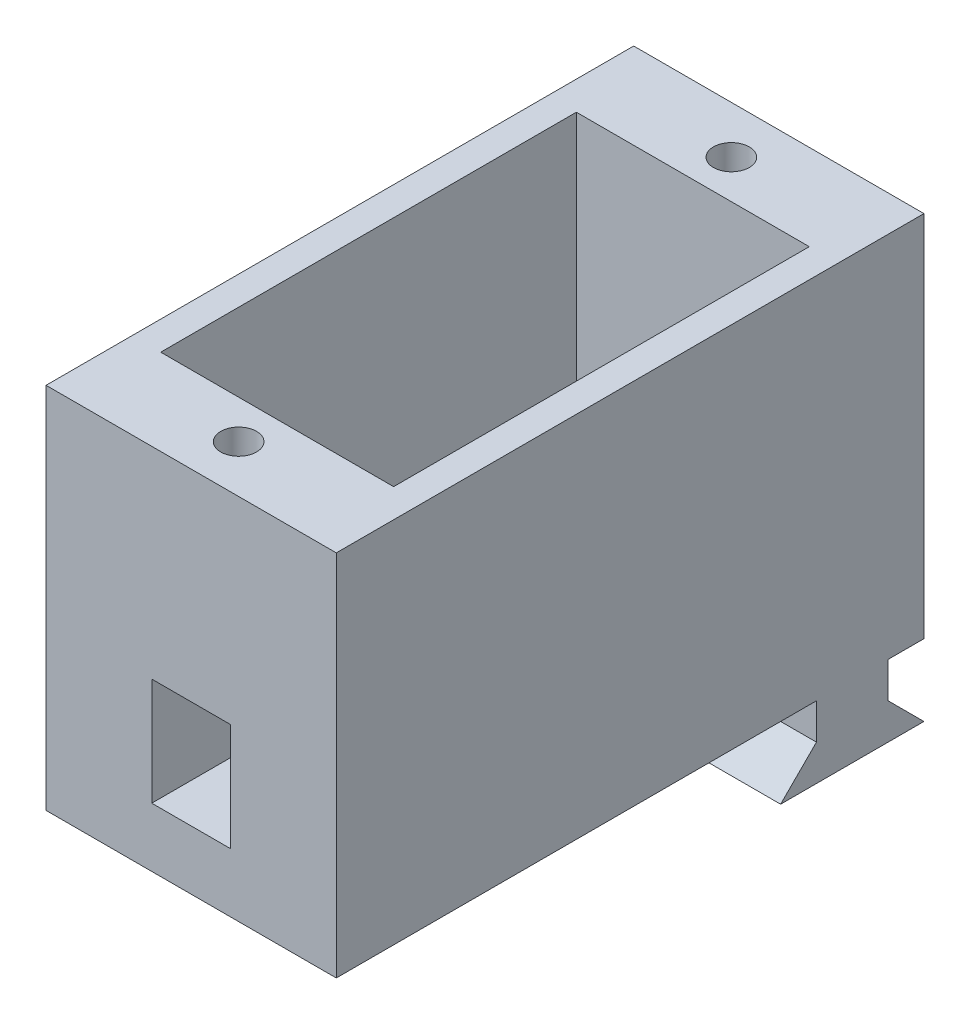
ISO-10303-21;
HEADER;
FILE_DESCRIPTION(('STEP AP214'),'2;1');
FILE_NAME('part.step','',(''),(''),'','','');
FILE_SCHEMA(('AUTOMOTIVE_DESIGN { 1 0 10303 214 1 1 1 1 }'));
ENDSEC;
DATA;
#1=APPLICATION_CONTEXT('core data for automotive mechanical design processes');
#2=APPLICATION_PROTOCOL_DEFINITION('international standard','automotive_design',2000,#1);
#3=PRODUCT_CONTEXT('',#1,'mechanical');
#4=PRODUCT('Part','Part','',(#3));
#5=PRODUCT_RELATED_PRODUCT_CATEGORY('part','',(#4));
#6=PRODUCT_DEFINITION_FORMATION('','',#4);
#7=PRODUCT_DEFINITION_CONTEXT('part definition',#1,'design');
#8=PRODUCT_DEFINITION('design','',#6,#7);
#9=PRODUCT_DEFINITION_SHAPE('','',#8);
#10=(LENGTH_UNIT() NAMED_UNIT(*) SI_UNIT(.MILLI.,.METRE.));
#11=(NAMED_UNIT(*) PLANE_ANGLE_UNIT() SI_UNIT($,.RADIAN.));
#12=(NAMED_UNIT(*) SI_UNIT($,.STERADIAN.) SOLID_ANGLE_UNIT());
#13=UNCERTAINTY_MEASURE_WITH_UNIT(LENGTH_MEASURE(1.E-05),#10,'distance_accuracy_value','');
#14=(GEOMETRIC_REPRESENTATION_CONTEXT(3) GLOBAL_UNCERTAINTY_ASSIGNED_CONTEXT((#13)) GLOBAL_UNIT_ASSIGNED_CONTEXT((#10,
#11,#12)) REPRESENTATION_CONTEXT('',''));
#15=CARTESIAN_POINT('',(0.,0.,0.));
#16=DIRECTION('',(0.,0.,1.));
#17=DIRECTION('',(1.,0.,0.));
#18=AXIS2_PLACEMENT_3D('',#15,#16,#17);
#19=CARTESIAN_POINT('',(0.,45.8,0.));
#20=DIRECTION('',(0.,-1.,0.));
#21=DIRECTION('',(0.,0.,-1.));
#22=AXIS2_PLACEMENT_3D('',#19,#20,#21);
#23=PLANE('',#22);
#24=DIRECTION('',(0.,0.,-1.));
#25=VECTOR('',#24,1.);
#26=CARTESIAN_POINT('',(-76.9,45.8,10.9));
#27=LINE('',#26,#25);
#28=CARTESIAN_POINT('',(-76.9,45.8,-19.9));
#29=VERTEX_POINT('',#28);
#30=CARTESIAN_POINT('',(-76.9,45.8,-21.9));
#31=VERTEX_POINT('',#30);
#32=EDGE_CURVE('E302',#29,#31,#27,.T.);
#33=ORIENTED_EDGE('',*,*,#32,.F.);
#34=DIRECTION('',(-1.,0.,0.));
#35=VECTOR('',#34,1.);
#36=CARTESIAN_POINT('',(0.,45.8,-19.9));
#37=LINE('',#36,#35);
#38=CARTESIAN_POINT('',(-93.1,45.8,-19.9));
#39=VERTEX_POINT('',#38);
#40=EDGE_CURVE('E11',#29,#39,#37,.T.);
#41=ORIENTED_EDGE('',*,*,#40,.T.);
#42=DIRECTION('',(0.,0.,1.));
#43=VECTOR('',#42,1.);
#44=CARTESIAN_POINT('',(-93.1,45.8,10.9));
#45=LINE('',#44,#43);
#46=CARTESIAN_POINT('',(-93.1,45.8,-21.9));
#47=VERTEX_POINT('',#46);
#48=EDGE_CURVE('E295',#47,#39,#45,.T.);
#49=ORIENTED_EDGE('',*,*,#48,.F.);
#50=DIRECTION('',(-1.,0.,0.));
#51=VECTOR('',#50,1.);
#52=CARTESIAN_POINT('',(-93.1,45.8,-21.9));
#53=LINE('',#52,#51);
#54=EDGE_CURVE('E285',#31,#47,#53,.T.);
#55=ORIENTED_EDGE('',*,*,#54,.F.);
#56=EDGE_LOOP('',(#33,#41,#49,#55));
#57=FACE_BOUND('',#56,.T.);
#58=ADVANCED_FACE('F39',(#57),#23,.T.);
#59=CARTESIAN_POINT('',(-85.,45.8,0.));
#60=DIRECTION('',(0.,1.,0.));
#61=DIRECTION('',(0.,0.,1.));
#62=AXIS2_PLACEMENT_3D('',#59,#60,#61);
#63=CIRCLE('',#62,3.15);
#64=CARTESIAN_POINT('',(-85.,45.8,3.15));
#65=VERTEX_POINT('',#64);
#66=EDGE_CURVE('E423',#65,#65,#63,.T.);
#67=ORIENTED_EDGE('',*,*,#66,.T.);
#68=EDGE_LOOP('',(#67));
#69=FACE_BOUND('',#68,.T.);
#70=CARTESIAN_POINT('',(-93.1,45.8,-15.9));
#71=VERTEX_POINT('',#70);
#72=CARTESIAN_POINT('',(-93.1,45.8,10.9));
#73=VERTEX_POINT('',#72);
#74=EDGE_CURVE('E279',#71,#73,#45,.T.);
#75=ORIENTED_EDGE('',*,*,#74,.F.);
#76=DIRECTION('',(1.,0.,0.));
#77=VECTOR('',#76,1.);
#78=CARTESIAN_POINT('',(0.,45.8,-15.9));
#79=LINE('',#78,#77);
#80=CARTESIAN_POINT('',(-76.9,45.8,-15.9));
#81=VERTEX_POINT('',#80);
#82=EDGE_CURVE('E48',#71,#81,#79,.T.);
#83=ORIENTED_EDGE('',*,*,#82,.T.);
#84=CARTESIAN_POINT('',(-76.9,45.8,10.9));
#85=VERTEX_POINT('',#84);
#86=EDGE_CURVE('E303',#85,#81,#27,.T.);
#87=ORIENTED_EDGE('',*,*,#86,.F.);
#88=DIRECTION('',(1.,0.,0.));
#89=VECTOR('',#88,1.);
#90=CARTESIAN_POINT('',(-93.1,45.8,10.9));
#91=LINE('',#90,#89);
#92=EDGE_CURVE('E299',#73,#85,#91,.T.);
#93=ORIENTED_EDGE('',*,*,#92,.F.);
#94=EDGE_LOOP('',(#75,#83,#87,#93));
#95=FACE_BOUND('',#94,.T.);
#96=ADVANCED_FACE('F329',(#69,#95),#23,.T.);
#97=CARTESIAN_POINT('',(-93.1,66.35,10.9));
#98=DIRECTION('',(1.,0.,0.));
#99=DIRECTION('',(0.,0.,-1.));
#100=AXIS2_PLACEMENT_3D('',#97,#98,#99);
#101=PLANE('',#100);
#102=ORIENTED_EDGE('',*,*,#48,.T.);
#103=DIRECTION('',(0.,1.,0.));
#104=VECTOR('',#103,1.);
#105=CARTESIAN_POINT('',(-93.1,43.7999999999999,-19.9));
#106=LINE('',#105,#104);
#107=CARTESIAN_POINT('',(-93.1,43.7999999999999,-19.9));
#108=VERTEX_POINT('',#107);
#109=EDGE_CURVE('E224',#108,#39,#106,.T.);
#110=ORIENTED_EDGE('',*,*,#109,.F.);
#111=DIRECTION('',(0.,0.707106781186544,0.707106781186551));
#112=VECTOR('',#111,1.);
#113=CARTESIAN_POINT('',(-93.1,41.7999999999999,-21.9));
#114=LINE('',#113,#112);
#115=CARTESIAN_POINT('',(-93.1,41.7999999999999,-21.9));
#116=VERTEX_POINT('',#115);
#117=EDGE_CURVE('E238',#116,#108,#114,.T.);
#118=ORIENTED_EDGE('',*,*,#117,.F.);
#119=DIRECTION('',(0.,0.,-1.));
#120=VECTOR('',#119,1.);
#121=CARTESIAN_POINT('',(-93.1,41.7999999999999,-13.9000000000001));
#122=LINE('',#121,#120);
#123=CARTESIAN_POINT('',(-93.1,41.7999999999999,-13.9000000000001));
#124=VERTEX_POINT('',#123);
#125=EDGE_CURVE('E259',#124,#116,#122,.T.);
#126=ORIENTED_EDGE('',*,*,#125,.F.);
#127=DIRECTION('',(0.,-0.707106781186565,0.70710678118653));
#128=VECTOR('',#127,1.);
#129=CARTESIAN_POINT('',(-93.1,43.8,-15.9));
#130=LINE('',#129,#128);
#131=CARTESIAN_POINT('',(-93.1,43.8,-15.9));
#132=VERTEX_POINT('',#131);
#133=EDGE_CURVE('E256',#132,#124,#130,.T.);
#134=ORIENTED_EDGE('',*,*,#133,.F.);
#135=DIRECTION('',(0.,-1.,0.));
#136=VECTOR('',#135,1.);
#137=CARTESIAN_POINT('',(-93.1,46.3,-15.9));
#138=LINE('',#137,#136);
#139=EDGE_CURVE('E253',#71,#132,#138,.T.);
#140=ORIENTED_EDGE('',*,*,#139,.F.);
#141=ORIENTED_EDGE('',*,*,#74,.T.);
#142=DIRECTION('',(0.,-1.,0.));
#143=VECTOR('',#142,1.);
#144=CARTESIAN_POINT('',(-93.1,66.35,10.9));
#145=LINE('',#144,#143);
#146=CARTESIAN_POINT('',(-93.1,66.35,10.9));
#147=VERTEX_POINT('',#146);
#148=EDGE_CURVE('E320',#147,#73,#145,.T.);
#149=ORIENTED_EDGE('',*,*,#148,.F.);
#150=DIRECTION('',(0.,0.,1.));
#151=VECTOR('',#150,1.);
#152=CARTESIAN_POINT('',(-93.1,66.35,10.9));
#153=LINE('',#152,#151);
#154=CARTESIAN_POINT('',(-93.1,66.35,-21.9));
#155=VERTEX_POINT('',#154);
#156=EDGE_CURVE('E280',#155,#147,#153,.T.);
#157=ORIENTED_EDGE('',*,*,#156,.F.);
#158=DIRECTION('',(0.,-1.,0.));
#159=VECTOR('',#158,1.);
#160=CARTESIAN_POINT('',(-93.1,66.35,-21.9));
#161=LINE('',#160,#159);
#162=EDGE_CURVE('E294',#155,#47,#161,.T.);
#163=ORIENTED_EDGE('',*,*,#162,.T.);
#164=EDGE_LOOP('',(#102,#110,#118,#126,#134,#140,#141,#149,#157,#163));
#165=FACE_BOUND('',#164,.T.);
#166=ADVANCED_FACE('F41',(#165),#101,.F.);
#167=CARTESIAN_POINT('',(-93.1,66.35,10.9));
#168=DIRECTION('',(0.,0.,-1.));
#169=DIRECTION('',(-1.,0.,0.));
#170=AXIS2_PLACEMENT_3D('',#167,#168,#169);
#171=PLANE('',#170);
#172=DIRECTION('',(1.,0.,0.));
#173=VECTOR('',#172,1.);
#174=CARTESIAN_POINT('',(-87.2,49.1,10.9));
#175=LINE('',#174,#173);
#176=CARTESIAN_POINT('',(-87.2,49.1,10.9));
#177=VERTEX_POINT('',#176);
#178=CARTESIAN_POINT('',(-82.8,49.1,10.9));
#179=VERTEX_POINT('',#178);
#180=EDGE_CURVE('E399',#177,#179,#175,.T.);
#181=ORIENTED_EDGE('',*,*,#180,.F.);
#182=DIRECTION('',(0.,-1.,0.));
#183=VECTOR('',#182,1.);
#184=CARTESIAN_POINT('',(-87.2,49.1,10.9));
#185=LINE('',#184,#183);
#186=CARTESIAN_POINT('',(-87.2,55.1,10.9));
#187=VERTEX_POINT('',#186);
#188=EDGE_CURVE('E55',#187,#177,#185,.T.);
#189=ORIENTED_EDGE('',*,*,#188,.F.);
#190=DIRECTION('',(-1.,0.,0.));
#191=VECTOR('',#190,1.);
#192=CARTESIAN_POINT('',(-87.2,55.1,10.9));
#193=LINE('',#192,#191);
#194=CARTESIAN_POINT('',(-82.8,55.1,10.9));
#195=VERTEX_POINT('',#194);
#196=EDGE_CURVE('E184',#195,#187,#193,.T.);
#197=ORIENTED_EDGE('',*,*,#196,.F.);
#198=DIRECTION('',(0.,1.,0.));
#199=VECTOR('',#198,1.);
#200=CARTESIAN_POINT('',(-82.8,49.1,10.9));
#201=LINE('',#200,#199);
#202=EDGE_CURVE('E402',#179,#195,#201,.T.);
#203=ORIENTED_EDGE('',*,*,#202,.F.);
#204=EDGE_LOOP('',(#181,#189,#197,#203));
#205=FACE_BOUND('',#204,.T.);
#206=ORIENTED_EDGE('',*,*,#92,.T.);
#207=DIRECTION('',(0.,-1.,0.));
#208=VECTOR('',#207,1.);
#209=CARTESIAN_POINT('',(-76.9,66.35,10.9));
#210=LINE('',#209,#208);
#211=CARTESIAN_POINT('',(-76.9,66.35,10.9));
#212=VERTEX_POINT('',#211);
#213=EDGE_CURVE('E316',#212,#85,#210,.T.);
#214=ORIENTED_EDGE('',*,*,#213,.F.);
#215=DIRECTION('',(1.,0.,0.));
#216=VECTOR('',#215,1.);
#217=CARTESIAN_POINT('',(-93.1,66.35,10.9));
#218=LINE('',#217,#216);
#219=EDGE_CURVE('E284',#147,#212,#218,.T.);
#220=ORIENTED_EDGE('',*,*,#219,.F.);
#221=ORIENTED_EDGE('',*,*,#148,.T.);
#222=EDGE_LOOP('',(#206,#214,#220,#221));
#223=FACE_BOUND('',#222,.T.);
#224=ADVANCED_FACE('F339',(#205,#223),#171,.F.);
#225=CARTESIAN_POINT('',(-76.9,66.35,10.9));
#226=DIRECTION('',(-1.,0.,0.));
#227=DIRECTION('',(0.,0.,1.));
#228=AXIS2_PLACEMENT_3D('',#225,#226,#227);
#229=PLANE('',#228);
#230=DIRECTION('',(0.,1.,0.));
#231=VECTOR('',#230,1.);
#232=CARTESIAN_POINT('',(-76.9,43.7999999999999,-19.9));
#233=LINE('',#232,#231);
#234=CARTESIAN_POINT('',(-76.9,43.7999999999999,-19.9));
#235=VERTEX_POINT('',#234);
#236=EDGE_CURVE('E233',#235,#29,#233,.T.);
#237=ORIENTED_EDGE('',*,*,#236,.T.);
#238=ORIENTED_EDGE('',*,*,#32,.T.);
#239=DIRECTION('',(0.,-1.,0.));
#240=VECTOR('',#239,1.);
#241=CARTESIAN_POINT('',(-76.9,66.35,-21.9));
#242=LINE('',#241,#240);
#243=CARTESIAN_POINT('',(-76.9,66.35,-21.9));
#244=VERTEX_POINT('',#243);
#245=EDGE_CURVE('E312',#244,#31,#242,.T.);
#246=ORIENTED_EDGE('',*,*,#245,.F.);
#247=DIRECTION('',(0.,0.,-1.));
#248=VECTOR('',#247,1.);
#249=CARTESIAN_POINT('',(-76.9,66.35,10.9));
#250=LINE('',#249,#248);
#251=EDGE_CURVE('E288',#212,#244,#250,.T.);
#252=ORIENTED_EDGE('',*,*,#251,.F.);
#253=ORIENTED_EDGE('',*,*,#213,.T.);
#254=ORIENTED_EDGE('',*,*,#86,.T.);
#255=DIRECTION('',(0.,-1.,0.));
#256=VECTOR('',#255,1.);
#257=CARTESIAN_POINT('',(-76.9,46.3,-15.9));
#258=LINE('',#257,#256);
#259=CARTESIAN_POINT('',(-76.9,43.8,-15.9));
#260=VERTEX_POINT('',#259);
#261=EDGE_CURVE('E237',#81,#260,#258,.T.);
#262=ORIENTED_EDGE('',*,*,#261,.T.);
#263=DIRECTION('',(0.,-0.707106781186565,0.70710678118653));
#264=VECTOR('',#263,1.);
#265=CARTESIAN_POINT('',(-76.9,43.8,-15.9));
#266=LINE('',#265,#264);
#267=CARTESIAN_POINT('',(-76.9,41.7999999999999,-13.9000000000001));
#268=VERTEX_POINT('',#267);
#269=EDGE_CURVE('E241',#260,#268,#266,.T.);
#270=ORIENTED_EDGE('',*,*,#269,.T.);
#271=DIRECTION('',(0.,0.,-1.));
#272=VECTOR('',#271,1.);
#273=CARTESIAN_POINT('',(-76.9,41.7999999999999,-13.9000000000001));
#274=LINE('',#273,#272);
#275=CARTESIAN_POINT('',(-76.9,41.7999999999999,-21.9));
#276=VERTEX_POINT('',#275);
#277=EDGE_CURVE('E244',#268,#276,#274,.T.);
#278=ORIENTED_EDGE('',*,*,#277,.T.);
#279=DIRECTION('',(0.,0.707106781186544,0.707106781186551));
#280=VECTOR('',#279,1.);
#281=CARTESIAN_POINT('',(-76.9,41.7999999999999,-21.9));
#282=LINE('',#281,#280);
#283=EDGE_CURVE('E247',#276,#235,#282,.T.);
#284=ORIENTED_EDGE('',*,*,#283,.T.);
#285=EDGE_LOOP('',(#237,#238,#246,#252,#253,#254,#262,#270,#278,#284));
#286=FACE_BOUND('',#285,.T.);
#287=ADVANCED_FACE('F333',(#286),#229,.F.);
#288=CARTESIAN_POINT('',(-93.1,66.35,-21.9));
#289=DIRECTION('',(0.,0.,1.));
#290=DIRECTION('',(1.,0.,0.));
#291=AXIS2_PLACEMENT_3D('',#288,#289,#290);
#292=PLANE('',#291);
#293=ORIENTED_EDGE('',*,*,#54,.T.);
#294=ORIENTED_EDGE('',*,*,#162,.F.);
#295=DIRECTION('',(-1.,0.,0.));
#296=VECTOR('',#295,1.);
#297=CARTESIAN_POINT('',(-93.1,66.35,-21.9));
#298=LINE('',#297,#296);
#299=EDGE_CURVE('E291',#244,#155,#298,.T.);
#300=ORIENTED_EDGE('',*,*,#299,.F.);
#301=ORIENTED_EDGE('',*,*,#245,.T.);
#302=EDGE_LOOP('',(#293,#294,#300,#301));
#303=FACE_BOUND('',#302,.T.);
#304=ADVANCED_FACE('F352',(#303),#292,.F.);
#305=CARTESIAN_POINT('',(0.,66.35,0.));
#306=DIRECTION('',(0.,-1.,0.));
#307=DIRECTION('',(0.,0.,-1.));
#308=AXIS2_PLACEMENT_3D('',#305,#306,#307);
#309=PLANE('',#308);
#310=CARTESIAN_POINT('',(-85.,66.35,8.25));
#311=DIRECTION('',(0.,1.,0.));
#312=DIRECTION('',(0.,0.,1.));
#313=AXIS2_PLACEMENT_3D('',#310,#311,#312);
#314=CIRCLE('',#313,1.);
#315=CARTESIAN_POINT('',(-85.,66.35,9.25));
#316=VERTEX_POINT('',#315);
#317=EDGE_CURVE('E427',#316,#316,#314,.T.);
#318=ORIENTED_EDGE('',*,*,#317,.F.);
#319=EDGE_LOOP('',(#318));
#320=FACE_BOUND('',#319,.T.);
#321=CARTESIAN_POINT('',(-85.,66.35,-19.25));
#322=DIRECTION('',(0.,1.,0.));
#323=DIRECTION('',(0.,0.,1.));
#324=AXIS2_PLACEMENT_3D('',#321,#322,#323);
#325=CIRCLE('',#324,1.);
#326=CARTESIAN_POINT('',(-85.,66.35,-18.25));
#327=VERTEX_POINT('',#326);
#328=EDGE_CURVE('E435',#327,#327,#325,.T.);
#329=ORIENTED_EDGE('',*,*,#328,.F.);
#330=EDGE_LOOP('',(#329));
#331=FACE_BOUND('',#330,.T.);
#332=DIRECTION('',(1.,0.,0.));
#333=VECTOR('',#332,1.);
#334=CARTESIAN_POINT('',(-91.5,66.35,6.1));
#335=LINE('',#334,#333);
#336=CARTESIAN_POINT('',(-91.5,66.35,6.1));
#337=VERTEX_POINT('',#336);
#338=CARTESIAN_POINT('',(-78.5,66.35,6.1));
#339=VERTEX_POINT('',#338);
#340=EDGE_CURVE('E208',#337,#339,#335,.T.);
#341=ORIENTED_EDGE('',*,*,#340,.F.);
#342=DIRECTION('',(0.,0.,1.));
#343=VECTOR('',#342,1.);
#344=CARTESIAN_POINT('',(-91.5,66.35,6.1));
#345=LINE('',#344,#343);
#346=CARTESIAN_POINT('',(-91.5,66.35,-17.1));
#347=VERTEX_POINT('',#346);
#348=EDGE_CURVE('E205',#347,#337,#345,.T.);
#349=ORIENTED_EDGE('',*,*,#348,.F.);
#350=DIRECTION('',(-1.,0.,0.));
#351=VECTOR('',#350,1.);
#352=CARTESIAN_POINT('',(-91.5,66.35,-17.1));
#353=LINE('',#352,#351);
#354=CARTESIAN_POINT('',(-78.5,66.35,-17.1));
#355=VERTEX_POINT('',#354);
#356=EDGE_CURVE('E217',#355,#347,#353,.T.);
#357=ORIENTED_EDGE('',*,*,#356,.F.);
#358=DIRECTION('',(0.,0.,-1.));
#359=VECTOR('',#358,1.);
#360=CARTESIAN_POINT('',(-78.5,66.35,6.1));
#361=LINE('',#360,#359);
#362=EDGE_CURVE('E213',#339,#355,#361,.T.);
#363=ORIENTED_EDGE('',*,*,#362,.F.);
#364=EDGE_LOOP('',(#341,#349,#357,#363));
#365=FACE_BOUND('',#364,.T.);
#366=ORIENTED_EDGE('',*,*,#156,.T.);
#367=ORIENTED_EDGE('',*,*,#219,.T.);
#368=ORIENTED_EDGE('',*,*,#251,.T.);
#369=ORIENTED_EDGE('',*,*,#299,.T.);
#370=EDGE_LOOP('',(#366,#367,#368,#369));
#371=FACE_BOUND('',#370,.T.);
#372=ADVANCED_FACE('F380',(#320,#331,#365,#371),#309,.F.);
#373=CARTESIAN_POINT('',(-76.9,43.7999999999999,-19.9));
#374=DIRECTION('',(0.,0.,1.));
#375=DIRECTION('',(1.,0.,0.));
#376=AXIS2_PLACEMENT_3D('',#373,#374,#375);
#377=PLANE('',#376);
#378=ORIENTED_EDGE('',*,*,#40,.F.);
#379=ORIENTED_EDGE('',*,*,#236,.F.);
#380=DIRECTION('',(-1.,0.,0.));
#381=VECTOR('',#380,1.);
#382=CARTESIAN_POINT('',(-76.9,43.7999999999999,-19.9));
#383=LINE('',#382,#381);
#384=EDGE_CURVE('E250',#235,#108,#383,.T.);
#385=ORIENTED_EDGE('',*,*,#384,.T.);
#386=ORIENTED_EDGE('',*,*,#109,.T.);
#387=EDGE_LOOP('',(#378,#379,#385,#386));
#388=FACE_BOUND('',#387,.T.);
#389=ADVANCED_FACE('F359',(#388),#377,.F.);
#390=CARTESIAN_POINT('',(-76.9,46.3,-15.9));
#391=DIRECTION('',(0.,0.,-1.));
#392=DIRECTION('',(-1.,0.,0.));
#393=AXIS2_PLACEMENT_3D('',#390,#391,#392);
#394=PLANE('',#393);
#395=ORIENTED_EDGE('',*,*,#82,.F.);
#396=ORIENTED_EDGE('',*,*,#139,.T.);
#397=DIRECTION('',(-1.,0.,0.));
#398=VECTOR('',#397,1.);
#399=CARTESIAN_POINT('',(-76.9,43.8,-15.9));
#400=LINE('',#399,#398);
#401=EDGE_CURVE('E275',#260,#132,#400,.T.);
#402=ORIENTED_EDGE('',*,*,#401,.F.);
#403=ORIENTED_EDGE('',*,*,#261,.F.);
#404=EDGE_LOOP('',(#395,#396,#402,#403));
#405=FACE_BOUND('',#404,.T.);
#406=ADVANCED_FACE('F372',(#405),#394,.F.);
#407=CARTESIAN_POINT('',(-76.9,43.8,-15.9));
#408=DIRECTION('',(0.,-0.70710678118653,-0.707106781186565));
#409=DIRECTION('',(0.,0.707106781186565,-0.70710678118653));
#410=AXIS2_PLACEMENT_3D('',#407,#408,#409);
#411=PLANE('',#410);
#412=ORIENTED_EDGE('',*,*,#133,.T.);
#413=DIRECTION('',(-1.,0.,0.));
#414=VECTOR('',#413,1.);
#415=CARTESIAN_POINT('',(-76.9,41.7999999999999,-13.9000000000001));
#416=LINE('',#415,#414);
#417=EDGE_CURVE('E271',#268,#124,#416,.T.);
#418=ORIENTED_EDGE('',*,*,#417,.F.);
#419=ORIENTED_EDGE('',*,*,#269,.F.);
#420=ORIENTED_EDGE('',*,*,#401,.T.);
#421=EDGE_LOOP('',(#412,#418,#419,#420));
#422=FACE_BOUND('',#421,.T.);
#423=ADVANCED_FACE('F370',(#422),#411,.F.);
#424=CARTESIAN_POINT('',(-76.9,41.7999999999999,-13.9000000000001));
#425=DIRECTION('',(0.,1.,0.));
#426=DIRECTION('',(0.,0.,1.));
#427=AXIS2_PLACEMENT_3D('',#424,#425,#426);
#428=PLANE('',#427);
#429=ORIENTED_EDGE('',*,*,#125,.T.);
#430=DIRECTION('',(-1.,0.,0.));
#431=VECTOR('',#430,1.);
#432=CARTESIAN_POINT('',(-76.9,41.7999999999999,-21.9));
#433=LINE('',#432,#431);
#434=EDGE_CURVE('E267',#276,#116,#433,.T.);
#435=ORIENTED_EDGE('',*,*,#434,.F.);
#436=ORIENTED_EDGE('',*,*,#277,.F.);
#437=ORIENTED_EDGE('',*,*,#417,.T.);
#438=EDGE_LOOP('',(#429,#435,#436,#437));
#439=FACE_BOUND('',#438,.T.);
#440=ADVANCED_FACE('F367',(#439),#428,.F.);
#441=CARTESIAN_POINT('',(-76.9,41.7999999999999,-21.9));
#442=DIRECTION('',(0.,-0.707106781186551,0.707106781186544));
#443=DIRECTION('',(0.,-0.707106781186544,-0.707106781186551));
#444=AXIS2_PLACEMENT_3D('',#441,#442,#443);
#445=PLANE('',#444);
#446=ORIENTED_EDGE('',*,*,#117,.T.);
#447=ORIENTED_EDGE('',*,*,#384,.F.);
#448=ORIENTED_EDGE('',*,*,#283,.F.);
#449=ORIENTED_EDGE('',*,*,#434,.T.);
#450=EDGE_LOOP('',(#446,#447,#448,#449));
#451=FACE_BOUND('',#450,.T.);
#452=ADVANCED_FACE('F363',(#451),#445,.F.);
#453=CARTESIAN_POINT('',(-91.5,49.1,6.1));
#454=DIRECTION('',(-1.,0.,0.));
#455=DIRECTION('',(0.,0.,1.));
#456=AXIS2_PLACEMENT_3D('',#453,#454,#455);
#457=PLANE('',#456);
#458=ORIENTED_EDGE('',*,*,#348,.T.);
#459=DIRECTION('',(0.,1.,0.));
#460=VECTOR('',#459,1.);
#461=CARTESIAN_POINT('',(-91.5,49.1,6.1));
#462=LINE('',#461,#460);
#463=CARTESIAN_POINT('',(-91.5,49.1,6.1));
#464=VERTEX_POINT('',#463);
#465=EDGE_CURVE('E204',#464,#337,#462,.T.);
#466=ORIENTED_EDGE('',*,*,#465,.F.);
#467=DIRECTION('',(0.,0.,1.));
#468=VECTOR('',#467,1.);
#469=CARTESIAN_POINT('',(-91.5,49.1,6.1));
#470=LINE('',#469,#468);
#471=CARTESIAN_POINT('',(-91.5,49.1,-17.1));
#472=VERTEX_POINT('',#471);
#473=EDGE_CURVE('E189',#472,#464,#470,.T.);
#474=ORIENTED_EDGE('',*,*,#473,.F.);
#475=DIRECTION('',(0.,1.,0.));
#476=VECTOR('',#475,1.);
#477=CARTESIAN_POINT('',(-91.5,49.1,-17.1));
#478=LINE('',#477,#476);
#479=EDGE_CURVE('E221',#472,#347,#478,.T.);
#480=ORIENTED_EDGE('',*,*,#479,.T.);
#481=EDGE_LOOP('',(#458,#466,#474,#480));
#482=FACE_BOUND('',#481,.T.);
#483=ADVANCED_FACE('F459',(#482),#457,.F.);
#484=CARTESIAN_POINT('',(-91.5,49.1,-17.1));
#485=DIRECTION('',(0.,0.,-1.));
#486=DIRECTION('',(-1.,0.,0.));
#487=AXIS2_PLACEMENT_3D('',#484,#485,#486);
#488=PLANE('',#487);
#489=ORIENTED_EDGE('',*,*,#356,.T.);
#490=ORIENTED_EDGE('',*,*,#479,.F.);
#491=DIRECTION('',(-1.,0.,0.));
#492=VECTOR('',#491,1.);
#493=CARTESIAN_POINT('',(-91.5,49.1,-17.1));
#494=LINE('',#493,#492);
#495=CARTESIAN_POINT('',(-78.5,49.1,-17.1));
#496=VERTEX_POINT('',#495);
#497=EDGE_CURVE('E197',#496,#472,#494,.T.);
#498=ORIENTED_EDGE('',*,*,#497,.F.);
#499=DIRECTION('',(0.,1.,0.));
#500=VECTOR('',#499,1.);
#501=CARTESIAN_POINT('',(-78.5,49.1,-17.1));
#502=LINE('',#501,#500);
#503=EDGE_CURVE('E225',#496,#355,#502,.T.);
#504=ORIENTED_EDGE('',*,*,#503,.T.);
#505=EDGE_LOOP('',(#489,#490,#498,#504));
#506=FACE_BOUND('',#505,.T.);
#507=ADVANCED_FACE('F462',(#506),#488,.F.);
#508=CARTESIAN_POINT('',(-78.5,49.1,6.1));
#509=DIRECTION('',(1.,0.,0.));
#510=DIRECTION('',(0.,0.,-1.));
#511=AXIS2_PLACEMENT_3D('',#508,#509,#510);
#512=PLANE('',#511);
#513=ORIENTED_EDGE('',*,*,#362,.T.);
#514=ORIENTED_EDGE('',*,*,#503,.F.);
#515=DIRECTION('',(0.,0.,-1.));
#516=VECTOR('',#515,1.);
#517=CARTESIAN_POINT('',(-78.5,49.1,6.1));
#518=LINE('',#517,#516);
#519=CARTESIAN_POINT('',(-78.5,49.1,6.1));
#520=VERTEX_POINT('',#519);
#521=EDGE_CURVE('E191',#520,#496,#518,.T.);
#522=ORIENTED_EDGE('',*,*,#521,.F.);
#523=DIRECTION('',(0.,1.,0.));
#524=VECTOR('',#523,1.);
#525=CARTESIAN_POINT('',(-78.5,49.1,6.1));
#526=LINE('',#525,#524);
#527=EDGE_CURVE('E228',#520,#339,#526,.T.);
#528=ORIENTED_EDGE('',*,*,#527,.T.);
#529=EDGE_LOOP('',(#513,#514,#522,#528));
#530=FACE_BOUND('',#529,.T.);
#531=ADVANCED_FACE('F464',(#530),#512,.F.);
#532=CARTESIAN_POINT('',(-91.5,49.1,6.1));
#533=DIRECTION('',(0.,0.,1.));
#534=DIRECTION('',(1.,0.,0.));
#535=AXIS2_PLACEMENT_3D('',#532,#533,#534);
#536=PLANE('',#535);
#537=DIRECTION('',(-1.,0.,0.));
#538=VECTOR('',#537,1.);
#539=CARTESIAN_POINT('',(-87.2,55.1,6.1));
#540=LINE('',#539,#538);
#541=CARTESIAN_POINT('',(-82.8,55.1,6.1));
#542=VERTEX_POINT('',#541);
#543=CARTESIAN_POINT('',(-87.2,55.1,6.1));
#544=VERTEX_POINT('',#543);
#545=EDGE_CURVE('E174',#542,#544,#540,.T.);
#546=ORIENTED_EDGE('',*,*,#545,.T.);
#547=DIRECTION('',(0.,-1.,0.));
#548=VECTOR('',#547,1.);
#549=CARTESIAN_POINT('',(-87.2,49.1,6.1));
#550=LINE('',#549,#548);
#551=CARTESIAN_POINT('',(-87.2,49.1,6.1));
#552=VERTEX_POINT('',#551);
#553=EDGE_CURVE('E166',#544,#552,#550,.T.);
#554=ORIENTED_EDGE('',*,*,#553,.T.);
#555=DIRECTION('',(1.,0.,0.));
#556=VECTOR('',#555,1.);
#557=CARTESIAN_POINT('',(-91.5,49.1,6.1));
#558=LINE('',#557,#556);
#559=EDGE_CURVE('E180',#464,#552,#558,.T.);
#560=ORIENTED_EDGE('',*,*,#559,.F.);
#561=ORIENTED_EDGE('',*,*,#465,.T.);
#562=ORIENTED_EDGE('',*,*,#340,.T.);
#563=ORIENTED_EDGE('',*,*,#527,.F.);
#564=CARTESIAN_POINT('',(-82.8,49.1,6.1));
#565=VERTEX_POINT('',#564);
#566=EDGE_CURVE('E192',#565,#520,#558,.T.);
#567=ORIENTED_EDGE('',*,*,#566,.F.);
#568=DIRECTION('',(0.,1.,0.));
#569=VECTOR('',#568,1.);
#570=CARTESIAN_POINT('',(-82.8,49.1,6.1));
#571=LINE('',#570,#569);
#572=EDGE_CURVE('E63',#565,#542,#571,.T.);
#573=ORIENTED_EDGE('',*,*,#572,.T.);
#574=EDGE_LOOP('',(#546,#554,#560,#561,#562,#563,#567,#573));
#575=FACE_BOUND('',#574,.T.);
#576=ADVANCED_FACE('F178',(#575),#536,.F.);
#577=CARTESIAN_POINT('',(0.,49.1,0.));
#578=DIRECTION('',(0.,-1.,0.));
#579=DIRECTION('',(0.,0.,-1.));
#580=AXIS2_PLACEMENT_3D('',#577,#578,#579);
#581=PLANE('',#580);
#582=ORIENTED_EDGE('',*,*,#473,.T.);
#583=ORIENTED_EDGE('',*,*,#559,.T.);
#584=DIRECTION('',(0.,0.,1.));
#585=VECTOR('',#584,1.);
#586=CARTESIAN_POINT('',(-87.2,49.1,6.1));
#587=LINE('',#586,#585);
#588=EDGE_CURVE('E163',#552,#177,#587,.T.);
#589=ORIENTED_EDGE('',*,*,#588,.T.);
#590=ORIENTED_EDGE('',*,*,#180,.T.);
#591=DIRECTION('',(0.,0.,1.));
#592=VECTOR('',#591,1.);
#593=CARTESIAN_POINT('',(-82.8,49.1,6.1));
#594=LINE('',#593,#592);
#595=EDGE_CURVE('E173',#565,#179,#594,.T.);
#596=ORIENTED_EDGE('',*,*,#595,.F.);
#597=ORIENTED_EDGE('',*,*,#566,.T.);
#598=ORIENTED_EDGE('',*,*,#521,.T.);
#599=ORIENTED_EDGE('',*,*,#497,.T.);
#600=EDGE_LOOP('',(#582,#583,#589,#590,#596,#597,#598,#599));
#601=FACE_BOUND('',#600,.T.);
#602=ADVANCED_FACE('F186',(#601),#581,.F.);
#603=CARTESIAN_POINT('',(-85.,60.35,-19.25));
#604=DIRECTION('',(0.,1.,0.));
#605=DIRECTION('',(0.,0.,1.));
#606=AXIS2_PLACEMENT_3D('',#603,#604,#605);
#607=CYLINDRICAL_SURFACE('',#606,1.);
#608=CARTESIAN_POINT('',(-85.,60.35,-19.25));
#609=DIRECTION('',(0.,1.,0.));
#610=DIRECTION('',(0.,0.,1.));
#611=AXIS2_PLACEMENT_3D('',#608,#609,#610);
#612=CIRCLE('',#611,1.);
#613=CARTESIAN_POINT('',(-85.,60.35,-18.25));
#614=VERTEX_POINT('',#613);
#615=EDGE_CURVE('E209',#614,#614,#612,.T.);
#616=CARTESIAN_POINT('',(-85.,60.35,-18.25));
#617=CARTESIAN_POINT('',(-85.,60.4125,-18.25));
#618=CARTESIAN_POINT('',(-85.,60.475,-18.25));
#619=CARTESIAN_POINT('',(-85.,60.6,-18.25));
#620=CARTESIAN_POINT('',(-85.,60.6625,-18.25));
#621=CARTESIAN_POINT('',(-85.,60.7875,-18.25));
#622=CARTESIAN_POINT('',(-85.,60.85,-18.25));
#623=CARTESIAN_POINT('',(-85.,60.975,-18.25));
#624=CARTESIAN_POINT('',(-85.,61.0375,-18.25));
#625=CARTESIAN_POINT('',(-85.,61.1625,-18.25));
#626=CARTESIAN_POINT('',(-85.,61.225,-18.25));
#627=CARTESIAN_POINT('',(-85.,61.35,-18.25));
#628=CARTESIAN_POINT('',(-85.,61.4125,-18.25));
#629=CARTESIAN_POINT('',(-85.,61.5375,-18.25));
#630=CARTESIAN_POINT('',(-85.,61.6,-18.25));
#631=CARTESIAN_POINT('',(-85.,61.725,-18.25));
#632=CARTESIAN_POINT('',(-85.,61.7875,-18.25));
#633=CARTESIAN_POINT('',(-85.,61.9125,-18.25));
#634=CARTESIAN_POINT('',(-85.,61.975,-18.25));
#635=CARTESIAN_POINT('',(-85.,62.1,-18.25));
#636=CARTESIAN_POINT('',(-85.,62.1625,-18.25));
#637=CARTESIAN_POINT('',(-85.,62.2875,-18.25));
#638=CARTESIAN_POINT('',(-85.,62.35,-18.25));
#639=CARTESIAN_POINT('',(-85.,62.475,-18.25));
#640=CARTESIAN_POINT('',(-85.,62.5375,-18.25));
#641=CARTESIAN_POINT('',(-85.,62.6625,-18.25));
#642=CARTESIAN_POINT('',(-85.,62.725,-18.25));
#643=CARTESIAN_POINT('',(-85.,62.85,-18.25));
#644=CARTESIAN_POINT('',(-85.,62.9125,-18.25));
#645=CARTESIAN_POINT('',(-85.,63.0375,-18.25));
#646=CARTESIAN_POINT('',(-85.,63.1,-18.25));
#647=CARTESIAN_POINT('',(-85.,63.225,-18.25));
#648=CARTESIAN_POINT('',(-85.,63.2875,-18.25));
#649=CARTESIAN_POINT('',(-85.,63.4125,-18.25));
#650=CARTESIAN_POINT('',(-85.,63.475,-18.25));
#651=CARTESIAN_POINT('',(-85.,63.6,-18.25));
#652=CARTESIAN_POINT('',(-85.,63.6625,-18.25));
#653=CARTESIAN_POINT('',(-85.,63.7875,-18.25));
#654=CARTESIAN_POINT('',(-85.,63.85,-18.25));
#655=CARTESIAN_POINT('',(-85.,63.975,-18.25));
#656=CARTESIAN_POINT('',(-85.,64.0375,-18.25));
#657=CARTESIAN_POINT('',(-85.,64.1625,-18.25));
#658=CARTESIAN_POINT('',(-85.,64.225,-18.25));
#659=CARTESIAN_POINT('',(-85.,64.35,-18.25));
#660=CARTESIAN_POINT('',(-85.,64.4125,-18.25));
#661=CARTESIAN_POINT('',(-85.,64.5375,-18.25));
#662=CARTESIAN_POINT('',(-85.,64.6,-18.25));
#663=CARTESIAN_POINT('',(-85.,64.725,-18.25));
#664=CARTESIAN_POINT('',(-85.,64.7875,-18.25));
#665=CARTESIAN_POINT('',(-85.,64.9125,-18.25));
#666=CARTESIAN_POINT('',(-85.,64.975,-18.25));
#667=CARTESIAN_POINT('',(-85.,65.1,-18.25));
#668=CARTESIAN_POINT('',(-85.,65.1625,-18.25));
#669=CARTESIAN_POINT('',(-85.,65.2875,-18.25));
#670=CARTESIAN_POINT('',(-85.,65.35,-18.25));
#671=CARTESIAN_POINT('',(-85.,65.475,-18.25));
#672=CARTESIAN_POINT('',(-85.,65.5375,-18.25));
#673=CARTESIAN_POINT('',(-85.,65.6625,-18.25));
#674=CARTESIAN_POINT('',(-85.,65.725,-18.25));
#675=CARTESIAN_POINT('',(-85.,65.85,-18.25));
#676=CARTESIAN_POINT('',(-85.,65.9125,-18.25));
#677=CARTESIAN_POINT('',(-85.,66.0375,-18.25));
#678=CARTESIAN_POINT('',(-85.,66.1,-18.25));
#679=CARTESIAN_POINT('',(-85.,66.225,-18.25));
#680=CARTESIAN_POINT('',(-85.,66.2875,-18.25));
#681=CARTESIAN_POINT('',(-85.,66.35,-18.25));
#682=B_SPLINE_CURVE_WITH_KNOTS('',3,(#616,#617,#618,#619,#620,#621,#622,#623,#624,#625,#626,
#627,#628,#629,#630,#631,#632,#633,#634,#635,#636,#637,#638,#639,#640,#641,#642,#643,#644,#645,
#646,#647,#648,#649,#650,#651,#652,#653,#654,#655,#656,#657,#658,#659,#660,#661,#662,#663,#664,
#665,#666,#667,#668,#669,#670,#671,#672,#673,#674,#675,#676,#677,#678,#679,#680,#681),
.UNSPECIFIED.,.F.,.F.,(4,2,2,2,2,2,2,2,2,2,2,2,2,2,2,2,2,2,2,2,2,2,2,2,2,2,2,2,2,2,2,2,4),(0.,
0.187499999999993,0.374999999999993,0.562499999999994,0.749999999999994,0.937499999999994,
1.12499999999999,1.31249999999999,1.49999999999999,1.68749999999999,1.87499999999999,
2.06249999999999,2.25,2.4375,2.625,2.8125,3.,3.1875,3.375,3.5625,3.75,3.9375,4.125,4.3125,4.5,
4.6875,4.875,5.0625,5.25,5.4375,5.62500000000001,5.8125,6.00000000000001),.UNSPECIFIED.);
#683=EDGE_CURVE('BSEAM445',#614,#327,#682,.T.);
#684=ORIENTED_EDGE('',*,*,#615,.F.);
#685=ORIENTED_EDGE('',*,*,#328,.T.);
#686=ORIENTED_EDGE('',*,*,#683,.T.);
#687=ORIENTED_EDGE('',*,*,#683,.F.);
#688=EDGE_LOOP('',(#684,#686,#685,#687));
#689=FACE_BOUND('',#688,.T.);
#690=ADVANCED_FACE('F445',(#689),#607,.F.);
#691=CARTESIAN_POINT('',(-85.,60.35,-19.25));
#692=DIRECTION('',(0.,1.,0.));
#693=DIRECTION('',(0.,0.,1.));
#694=AXIS2_PLACEMENT_3D('',#691,#692,#693);
#695=PLANE('',#694);
#696=ORIENTED_EDGE('',*,*,#615,.T.);
#697=EDGE_LOOP('',(#696));
#698=FACE_BOUND('',#697,.T.);
#699=ADVANCED_FACE('F495',(#698),#695,.T.);
#700=CARTESIAN_POINT('',(-85.,60.35,8.25));
#701=DIRECTION('',(0.,1.,0.));
#702=DIRECTION('',(0.,0.,1.));
#703=AXIS2_PLACEMENT_3D('',#700,#701,#702);
#704=CYLINDRICAL_SURFACE('',#703,1.);
#705=CARTESIAN_POINT('',(-85.,60.35,8.25));
#706=DIRECTION('',(0.,1.,0.));
#707=DIRECTION('',(0.,0.,1.));
#708=AXIS2_PLACEMENT_3D('',#705,#706,#707);
#709=CIRCLE('',#708,1.);
#710=CARTESIAN_POINT('',(-85.,60.35,9.25));
#711=VERTEX_POINT('',#710);
#712=EDGE_CURVE('E431',#711,#711,#709,.T.);
#713=CARTESIAN_POINT('',(-85.,60.35,9.25));
#714=CARTESIAN_POINT('',(-85.,60.4125,9.25));
#715=CARTESIAN_POINT('',(-85.,60.475,9.25));
#716=CARTESIAN_POINT('',(-85.,60.6,9.25));
#717=CARTESIAN_POINT('',(-85.,60.6625,9.25));
#718=CARTESIAN_POINT('',(-85.,60.7875,9.25));
#719=CARTESIAN_POINT('',(-85.,60.85,9.25));
#720=CARTESIAN_POINT('',(-85.,60.975,9.25));
#721=CARTESIAN_POINT('',(-85.,61.0375,9.25));
#722=CARTESIAN_POINT('',(-85.,61.1625,9.25));
#723=CARTESIAN_POINT('',(-85.,61.225,9.25));
#724=CARTESIAN_POINT('',(-85.,61.35,9.25));
#725=CARTESIAN_POINT('',(-85.,61.4125,9.25));
#726=CARTESIAN_POINT('',(-85.,61.5375,9.25));
#727=CARTESIAN_POINT('',(-85.,61.6,9.25));
#728=CARTESIAN_POINT('',(-85.,61.725,9.25));
#729=CARTESIAN_POINT('',(-85.,61.7875,9.25));
#730=CARTESIAN_POINT('',(-85.,61.9125,9.25));
#731=CARTESIAN_POINT('',(-85.,61.975,9.25));
#732=CARTESIAN_POINT('',(-85.,62.1,9.25));
#733=CARTESIAN_POINT('',(-85.,62.1625,9.25));
#734=CARTESIAN_POINT('',(-85.,62.2875,9.25));
#735=CARTESIAN_POINT('',(-85.,62.35,9.25));
#736=CARTESIAN_POINT('',(-85.,62.475,9.25));
#737=CARTESIAN_POINT('',(-85.,62.5375,9.25));
#738=CARTESIAN_POINT('',(-85.,62.6625,9.25));
#739=CARTESIAN_POINT('',(-85.,62.725,9.25));
#740=CARTESIAN_POINT('',(-85.,62.85,9.25));
#741=CARTESIAN_POINT('',(-85.,62.9125,9.25));
#742=CARTESIAN_POINT('',(-85.,63.0375,9.25));
#743=CARTESIAN_POINT('',(-85.,63.1,9.25));
#744=CARTESIAN_POINT('',(-85.,63.225,9.25));
#745=CARTESIAN_POINT('',(-85.,63.2875,9.25));
#746=CARTESIAN_POINT('',(-85.,63.4125,9.25));
#747=CARTESIAN_POINT('',(-85.,63.475,9.25));
#748=CARTESIAN_POINT('',(-85.,63.6,9.25));
#749=CARTESIAN_POINT('',(-85.,63.6625,9.25));
#750=CARTESIAN_POINT('',(-85.,63.7875,9.25));
#751=CARTESIAN_POINT('',(-85.,63.85,9.25));
#752=CARTESIAN_POINT('',(-85.,63.975,9.25));
#753=CARTESIAN_POINT('',(-85.,64.0375,9.25));
#754=CARTESIAN_POINT('',(-85.,64.1625,9.25));
#755=CARTESIAN_POINT('',(-85.,64.225,9.25));
#756=CARTESIAN_POINT('',(-85.,64.35,9.25));
#757=CARTESIAN_POINT('',(-85.,64.4125,9.25));
#758=CARTESIAN_POINT('',(-85.,64.5375,9.25));
#759=CARTESIAN_POINT('',(-85.,64.6,9.25));
#760=CARTESIAN_POINT('',(-85.,64.725,9.25));
#761=CARTESIAN_POINT('',(-85.,64.7875,9.25));
#762=CARTESIAN_POINT('',(-85.,64.9125,9.25));
#763=CARTESIAN_POINT('',(-85.,64.975,9.25));
#764=CARTESIAN_POINT('',(-85.,65.1,9.25));
#765=CARTESIAN_POINT('',(-85.,65.1625,9.25));
#766=CARTESIAN_POINT('',(-85.,65.2875,9.25));
#767=CARTESIAN_POINT('',(-85.,65.35,9.25));
#768=CARTESIAN_POINT('',(-85.,65.475,9.25));
#769=CARTESIAN_POINT('',(-85.,65.5375,9.25));
#770=CARTESIAN_POINT('',(-85.,65.6625,9.25));
#771=CARTESIAN_POINT('',(-85.,65.725,9.25));
#772=CARTESIAN_POINT('',(-85.,65.85,9.25));
#773=CARTESIAN_POINT('',(-85.,65.9125,9.25));
#774=CARTESIAN_POINT('',(-85.,66.0375,9.25));
#775=CARTESIAN_POINT('',(-85.,66.1,9.25));
#776=CARTESIAN_POINT('',(-85.,66.225,9.25));
#777=CARTESIAN_POINT('',(-85.,66.2875,9.25));
#778=CARTESIAN_POINT('',(-85.,66.35,9.25));
#779=B_SPLINE_CURVE_WITH_KNOTS('',3,(#713,#714,#715,#716,#717,#718,#719,#720,#721,#722,#723,
#724,#725,#726,#727,#728,#729,#730,#731,#732,#733,#734,#735,#736,#737,#738,#739,#740,#741,#742,
#743,#744,#745,#746,#747,#748,#749,#750,#751,#752,#753,#754,#755,#756,#757,#758,#759,#760,#761,
#762,#763,#764,#765,#766,#767,#768,#769,#770,#771,#772,#773,#774,#775,#776,#777,#778),
.UNSPECIFIED.,.F.,.F.,(4,2,2,2,2,2,2,2,2,2,2,2,2,2,2,2,2,2,2,2,2,2,2,2,2,2,2,2,2,2,2,2,4),(0.,
0.187499999999993,0.374999999999993,0.562499999999994,0.749999999999994,0.937499999999994,
1.12499999999999,1.31249999999999,1.49999999999999,1.68749999999999,1.87499999999999,
2.06249999999999,2.25,2.4375,2.625,2.8125,3.,3.1875,3.375,3.5625,3.75,3.9375,4.125,4.3125,4.5,
4.6875,4.875,5.0625,5.25,5.4375,5.62500000000001,5.8125,6.00000000000001),.UNSPECIFIED.);
#780=EDGE_CURVE('BSEAM491',#711,#316,#779,.T.);
#781=ORIENTED_EDGE('',*,*,#712,.F.);
#782=ORIENTED_EDGE('',*,*,#317,.T.);
#783=ORIENTED_EDGE('',*,*,#780,.T.);
#784=ORIENTED_EDGE('',*,*,#780,.F.);
#785=EDGE_LOOP('',(#781,#783,#782,#784));
#786=FACE_BOUND('',#785,.T.);
#787=ADVANCED_FACE('F491',(#786),#704,.F.);
#788=CARTESIAN_POINT('',(-85.,60.35,8.25));
#789=DIRECTION('',(0.,1.,0.));
#790=DIRECTION('',(0.,0.,1.));
#791=AXIS2_PLACEMENT_3D('',#788,#789,#790);
#792=PLANE('',#791);
#793=ORIENTED_EDGE('',*,*,#712,.T.);
#794=EDGE_LOOP('',(#793));
#795=FACE_BOUND('',#794,.T.);
#796=ADVANCED_FACE('F487',(#795),#792,.T.);
#797=CARTESIAN_POINT('',(-85.,45.8,0.));
#798=DIRECTION('',(0.,1.,0.));
#799=DIRECTION('',(0.,0.,1.));
#800=AXIS2_PLACEMENT_3D('',#797,#798,#799);
#801=CYLINDRICAL_SURFACE('',#800,3.15);
#802=ORIENTED_EDGE('',*,*,#66,.F.);
#803=EDGE_LOOP('',(#802));
#804=FACE_BOUND('',#803,.T.);
#805=CARTESIAN_POINT('',(-85.,48.4,0.));
#806=DIRECTION('',(0.,1.,0.));
#807=DIRECTION('',(0.,0.,1.));
#808=AXIS2_PLACEMENT_3D('',#805,#806,#807);
#809=CIRCLE('',#808,3.15);
#810=CARTESIAN_POINT('',(-85.,48.4,3.15));
#811=VERTEX_POINT('',#810);
#812=EDGE_CURVE('E417',#811,#811,#809,.T.);
#813=ORIENTED_EDGE('',*,*,#812,.T.);
#814=EDGE_LOOP('',(#813));
#815=FACE_BOUND('',#814,.T.);
#816=ADVANCED_FACE('F483',(#804,#815),#801,.F.);
#817=CARTESIAN_POINT('',(-85.,48.4,0.));
#818=DIRECTION('',(0.,1.,0.));
#819=DIRECTION('',(0.,0.,1.));
#820=AXIS2_PLACEMENT_3D('',#817,#818,#819);
#821=PLANE('',#820);
#822=ORIENTED_EDGE('',*,*,#812,.F.);
#823=EDGE_LOOP('',(#822));
#824=FACE_BOUND('',#823,.T.);
#825=ADVANCED_FACE('F478',(#824),#821,.F.);
#826=CARTESIAN_POINT('',(-87.2,49.1,6.1));
#827=DIRECTION('',(-1.,0.,0.));
#828=DIRECTION('',(0.,0.,1.));
#829=AXIS2_PLACEMENT_3D('',#826,#827,#828);
#830=PLANE('',#829);
#831=ORIENTED_EDGE('',*,*,#188,.T.);
#832=ORIENTED_EDGE('',*,*,#588,.F.);
#833=ORIENTED_EDGE('',*,*,#553,.F.);
#834=DIRECTION('',(0.,0.,1.));
#835=VECTOR('',#834,1.);
#836=CARTESIAN_POINT('',(-87.2,55.1,6.1));
#837=LINE('',#836,#835);
#838=EDGE_CURVE('E414',#544,#187,#837,.T.);
#839=ORIENTED_EDGE('',*,*,#838,.T.);
#840=EDGE_LOOP('',(#831,#832,#833,#839));
#841=FACE_BOUND('',#840,.T.);
#842=ADVANCED_FACE('F165',(#841),#830,.F.);
#843=CARTESIAN_POINT('',(-87.2,55.1,6.1));
#844=DIRECTION('',(0.,1.,0.));
#845=DIRECTION('',(0.,0.,1.));
#846=AXIS2_PLACEMENT_3D('',#843,#844,#845);
#847=PLANE('',#846);
#848=ORIENTED_EDGE('',*,*,#196,.T.);
#849=ORIENTED_EDGE('',*,*,#838,.F.);
#850=ORIENTED_EDGE('',*,*,#545,.F.);
#851=DIRECTION('',(0.,0.,1.));
#852=VECTOR('',#851,1.);
#853=CARTESIAN_POINT('',(-82.8,55.1,6.1));
#854=LINE('',#853,#852);
#855=EDGE_CURVE('E418',#542,#195,#854,.T.);
#856=ORIENTED_EDGE('',*,*,#855,.T.);
#857=EDGE_LOOP('',(#848,#849,#850,#856));
#858=FACE_BOUND('',#857,.T.);
#859=ADVANCED_FACE('F470',(#858),#847,.F.);
#860=CARTESIAN_POINT('',(-82.8,49.1,6.1));
#861=DIRECTION('',(1.,0.,0.));
#862=DIRECTION('',(0.,0.,-1.));
#863=AXIS2_PLACEMENT_3D('',#860,#861,#862);
#864=PLANE('',#863);
#865=ORIENTED_EDGE('',*,*,#202,.T.);
#866=ORIENTED_EDGE('',*,*,#855,.F.);
#867=ORIENTED_EDGE('',*,*,#572,.F.);
#868=ORIENTED_EDGE('',*,*,#595,.T.);
#869=EDGE_LOOP('',(#865,#866,#867,#868));
#870=FACE_BOUND('',#869,.T.);
#871=ADVANCED_FACE('F468',(#870),#864,.F.);
#872=CLOSED_SHELL('',(#58,#96,#166,#224,#287,#304,#372,#389,#406,#423,#440,#452,#483,#507,#531,
#576,#602,#690,#699,#787,#796,#816,#825,#842,#859,#871));
#873=MANIFOLD_SOLID_BREP('B2',#872);
#874=ADVANCED_BREP_SHAPE_REPRESENTATION('',(#18,#873),#14);
#875=SHAPE_DEFINITION_REPRESENTATION(#9,#874);
ENDSEC;
END-ISO-10303-21;
